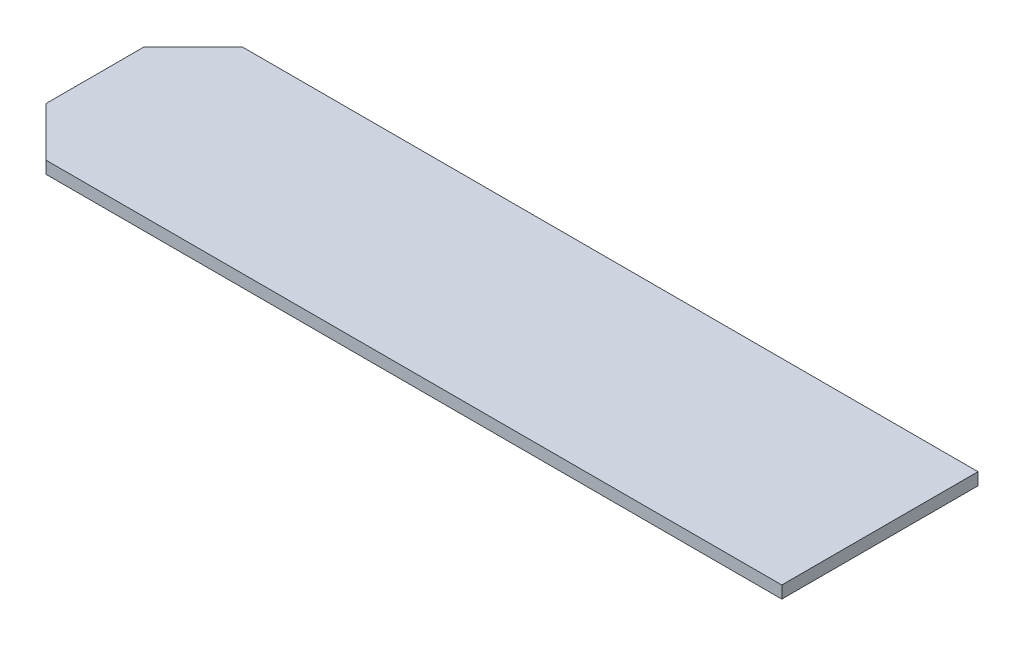
ISO-10303-21;
HEADER;
FILE_DESCRIPTION(('STEP AP214'),'2;1');
FILE_NAME('part.step','',(''),(''),'','','');
FILE_SCHEMA(('AUTOMOTIVE_DESIGN { 1 0 10303 214 1 1 1 1 }'));
ENDSEC;
DATA;
#1=APPLICATION_CONTEXT('core data for automotive mechanical design processes');
#2=APPLICATION_PROTOCOL_DEFINITION('international standard','automotive_design',2000,#1);
#3=PRODUCT_CONTEXT('',#1,'mechanical');
#4=PRODUCT('Part','Part','',(#3));
#5=PRODUCT_RELATED_PRODUCT_CATEGORY('part','',(#4));
#6=PRODUCT_DEFINITION_FORMATION('','',#4);
#7=PRODUCT_DEFINITION_CONTEXT('part definition',#1,'design');
#8=PRODUCT_DEFINITION('design','',#6,#7);
#9=PRODUCT_DEFINITION_SHAPE('','',#8);
#10=(LENGTH_UNIT() NAMED_UNIT(*) SI_UNIT(.MILLI.,.METRE.));
#11=(NAMED_UNIT(*) PLANE_ANGLE_UNIT() SI_UNIT($,.RADIAN.));
#12=(NAMED_UNIT(*) SI_UNIT($,.STERADIAN.) SOLID_ANGLE_UNIT());
#13=UNCERTAINTY_MEASURE_WITH_UNIT(LENGTH_MEASURE(1.E-05),#10,'distance_accuracy_value','');
#14=(GEOMETRIC_REPRESENTATION_CONTEXT(3) GLOBAL_UNCERTAINTY_ASSIGNED_CONTEXT((#13)) GLOBAL_UNIT_ASSIGNED_CONTEXT((#10,
#11,#12)) REPRESENTATION_CONTEXT('',''));
#15=CARTESIAN_POINT('',(0.,0.,0.));
#16=DIRECTION('',(0.,0.,1.));
#17=DIRECTION('',(1.,0.,0.));
#18=AXIS2_PLACEMENT_3D('',#15,#16,#17);
#19=CARTESIAN_POINT('',(0.,3.175,0.));
#20=DIRECTION('',(-1.,0.,0.));
#21=DIRECTION('',(0.,0.,1.));
#22=AXIS2_PLACEMENT_3D('',#19,#20,#21);
#23=PLANE('',#22);
#24=DIRECTION('',(0.,0.,-1.));
#25=VECTOR('',#24,1.);
#26=CARTESIAN_POINT('',(0.,0.,0.));
#27=LINE('',#26,#25);
#28=CARTESIAN_POINT('',(0.,0.,0.));
#29=VERTEX_POINT('',#28);
#30=CARTESIAN_POINT('',(0.,0.,-50.8));
#31=VERTEX_POINT('',#30);
#32=EDGE_CURVE('E105',#29,#31,#27,.T.);
#33=ORIENTED_EDGE('',*,*,#32,.T.);
#34=DIRECTION('',(0.,-1.,0.));
#35=VECTOR('',#34,1.);
#36=CARTESIAN_POINT('',(0.,3.175,-50.8));
#37=LINE('',#36,#35);
#38=CARTESIAN_POINT('',(0.,3.175,-50.8));
#39=VERTEX_POINT('',#38);
#40=EDGE_CURVE('E90',#39,#31,#37,.T.);
#41=ORIENTED_EDGE('',*,*,#40,.F.);
#42=DIRECTION('',(0.,0.,-1.));
#43=VECTOR('',#42,1.);
#44=CARTESIAN_POINT('',(0.,3.175,0.));
#45=LINE('',#44,#43);
#46=CARTESIAN_POINT('',(0.,3.175,0.));
#47=VERTEX_POINT('',#46);
#48=EDGE_CURVE('E94',#47,#39,#45,.T.);
#49=ORIENTED_EDGE('',*,*,#48,.F.);
#50=DIRECTION('',(0.,-1.,0.));
#51=VECTOR('',#50,1.);
#52=CARTESIAN_POINT('',(0.,3.175,0.));
#53=LINE('',#52,#51);
#54=EDGE_CURVE('E107',#47,#29,#53,.T.);
#55=ORIENTED_EDGE('',*,*,#54,.T.);
#56=EDGE_LOOP('',(#33,#41,#49,#55));
#57=FACE_BOUND('',#56,.T.);
#58=ADVANCED_FACE('F33',(#57),#23,.F.);
#59=CARTESIAN_POINT('',(0.,3.175,-50.8));
#60=DIRECTION('',(0.,0.,1.));
#61=DIRECTION('',(1.,0.,0.));
#62=AXIS2_PLACEMENT_3D('',#59,#60,#61);
#63=PLANE('',#62);
#64=DIRECTION('',(-1.,0.,0.));
#65=VECTOR('',#64,1.);
#66=CARTESIAN_POINT('',(0.,0.,-50.8));
#67=LINE('',#66,#65);
#68=CARTESIAN_POINT('',(-190.5,0.,-50.8));
#69=VERTEX_POINT('',#68);
#70=EDGE_CURVE('E133',#31,#69,#67,.T.);
#71=ORIENTED_EDGE('',*,*,#70,.T.);
#72=DIRECTION('',(0.,1.,0.));
#73=VECTOR('',#72,1.);
#74=CARTESIAN_POINT('',(-190.5,3.175,-50.8));
#75=LINE('',#74,#73);
#76=CARTESIAN_POINT('',(-190.5,3.175,-50.8));
#77=VERTEX_POINT('',#76);
#78=EDGE_CURVE('E56',#69,#77,#75,.T.);
#79=ORIENTED_EDGE('',*,*,#78,.T.);
#80=DIRECTION('',(-1.,0.,0.));
#81=VECTOR('',#80,1.);
#82=CARTESIAN_POINT('',(0.,3.175,-50.8));
#83=LINE('',#82,#81);
#84=EDGE_CURVE('E86',#39,#77,#83,.T.);
#85=ORIENTED_EDGE('',*,*,#84,.F.);
#86=ORIENTED_EDGE('',*,*,#40,.T.);
#87=EDGE_LOOP('',(#71,#79,#85,#86));
#88=FACE_BOUND('',#87,.T.);
#89=ADVANCED_FACE('F88',(#88),#63,.F.);
#90=CARTESIAN_POINT('',(-203.2,3.175,0.));
#91=DIRECTION('',(1.,0.,0.));
#92=DIRECTION('',(0.,0.,-1.));
#93=AXIS2_PLACEMENT_3D('',#90,#91,#92);
#94=PLANE('',#93);
#95=DIRECTION('',(0.,0.,1.));
#96=VECTOR('',#95,1.);
#97=CARTESIAN_POINT('',(-203.2,3.175,0.));
#98=LINE('',#97,#96);
#99=CARTESIAN_POINT('',(-203.2,3.175,-38.1));
#100=VERTEX_POINT('',#99);
#101=CARTESIAN_POINT('',(-203.2,3.175,-12.7));
#102=VERTEX_POINT('',#101);
#103=EDGE_CURVE('E93',#100,#102,#98,.T.);
#104=ORIENTED_EDGE('',*,*,#103,.F.);
#105=DIRECTION('',(0.,-1.,0.));
#106=VECTOR('',#105,1.);
#107=CARTESIAN_POINT('',(-203.2,3.175,-38.1));
#108=LINE('',#107,#106);
#109=CARTESIAN_POINT('',(-203.2,0.,-38.1));
#110=VERTEX_POINT('',#109);
#111=EDGE_CURVE('E109',#100,#110,#108,.T.);
#112=ORIENTED_EDGE('',*,*,#111,.T.);
#113=DIRECTION('',(0.,0.,1.));
#114=VECTOR('',#113,1.);
#115=CARTESIAN_POINT('',(-203.2,0.,0.));
#116=LINE('',#115,#114);
#117=CARTESIAN_POINT('',(-203.2,0.,-12.7));
#118=VERTEX_POINT('',#117);
#119=EDGE_CURVE('E134',#110,#118,#116,.T.);
#120=ORIENTED_EDGE('',*,*,#119,.T.);
#121=DIRECTION('',(0.,1.,0.));
#122=VECTOR('',#121,1.);
#123=CARTESIAN_POINT('',(-203.2,3.175,-12.7));
#124=LINE('',#123,#122);
#125=EDGE_CURVE('E106',#118,#102,#124,.T.);
#126=ORIENTED_EDGE('',*,*,#125,.T.);
#127=EDGE_LOOP('',(#104,#112,#120,#126));
#128=FACE_BOUND('',#127,.T.);
#129=ADVANCED_FACE('F125',(#128),#94,.F.);
#130=CARTESIAN_POINT('',(0.,3.175,0.));
#131=DIRECTION('',(0.,0.,-1.));
#132=DIRECTION('',(-1.,0.,0.));
#133=AXIS2_PLACEMENT_3D('',#130,#131,#132);
#134=PLANE('',#133);
#135=DIRECTION('',(1.,0.,0.));
#136=VECTOR('',#135,1.);
#137=CARTESIAN_POINT('',(0.,3.175,0.));
#138=LINE('',#137,#136);
#139=CARTESIAN_POINT('',(-190.5,3.175,0.));
#140=VERTEX_POINT('',#139);
#141=EDGE_CURVE('E98',#140,#47,#138,.T.);
#142=ORIENTED_EDGE('',*,*,#141,.F.);
#143=DIRECTION('',(0.,-1.,0.));
#144=VECTOR('',#143,1.);
#145=CARTESIAN_POINT('',(-190.5,3.175,0.));
#146=LINE('',#145,#144);
#147=CARTESIAN_POINT('',(-190.5,0.,0.));
#148=VERTEX_POINT('',#147);
#149=EDGE_CURVE('E11',#140,#148,#146,.T.);
#150=ORIENTED_EDGE('',*,*,#149,.T.);
#151=DIRECTION('',(1.,0.,0.));
#152=VECTOR('',#151,1.);
#153=CARTESIAN_POINT('',(0.,0.,0.));
#154=LINE('',#153,#152);
#155=EDGE_CURVE('E102',#148,#29,#154,.T.);
#156=ORIENTED_EDGE('',*,*,#155,.T.);
#157=ORIENTED_EDGE('',*,*,#54,.F.);
#158=EDGE_LOOP('',(#142,#150,#156,#157));
#159=FACE_BOUND('',#158,.T.);
#160=ADVANCED_FACE('F141',(#159),#134,.F.);
#161=CARTESIAN_POINT('',(0.,3.175,0.));
#162=DIRECTION('',(0.,1.,0.));
#163=DIRECTION('',(0.,0.,1.));
#164=AXIS2_PLACEMENT_3D('',#161,#162,#163);
#165=PLANE('',#164);
#166=ORIENTED_EDGE('',*,*,#84,.T.);
#167=DIRECTION('',(0.707106781186548,0.,-0.707106781186547));
#168=VECTOR('',#167,1.);
#169=CARTESIAN_POINT('',(-120.65,3.175,-120.65));
#170=LINE('',#169,#168);
#171=EDGE_CURVE('E41',#77,#100,#170,.F.);
#172=ORIENTED_EDGE('',*,*,#171,.T.);
#173=ORIENTED_EDGE('',*,*,#103,.T.);
#174=DIRECTION('',(-0.707106781186546,0.,-0.707106781186549));
#175=VECTOR('',#174,1.);
#176=CARTESIAN_POINT('',(-95.2500000000004,3.175,95.25));
#177=LINE('',#176,#175);
#178=EDGE_CURVE('E48',#102,#140,#177,.F.);
#179=ORIENTED_EDGE('',*,*,#178,.T.);
#180=ORIENTED_EDGE('',*,*,#141,.T.);
#181=ORIENTED_EDGE('',*,*,#48,.T.);
#182=EDGE_LOOP('',(#166,#172,#173,#179,#180,#181));
#183=FACE_BOUND('',#182,.T.);
#184=ADVANCED_FACE('F97',(#183),#165,.T.);
#185=CARTESIAN_POINT('',(0.,0.,0.));
#186=DIRECTION('',(0.,1.,0.));
#187=DIRECTION('',(0.,0.,1.));
#188=AXIS2_PLACEMENT_3D('',#185,#186,#187);
#189=PLANE('',#188);
#190=ORIENTED_EDGE('',*,*,#119,.F.);
#191=DIRECTION('',(-0.707106781186548,0.,0.707106781186547));
#192=VECTOR('',#191,1.);
#193=CARTESIAN_POINT('',(-203.2,0.,-38.1));
#194=LINE('',#193,#192);
#195=EDGE_CURVE('E118',#110,#69,#194,.F.);
#196=ORIENTED_EDGE('',*,*,#195,.T.);
#197=ORIENTED_EDGE('',*,*,#70,.F.);
#198=ORIENTED_EDGE('',*,*,#32,.F.);
#199=ORIENTED_EDGE('',*,*,#155,.F.);
#200=DIRECTION('',(0.707106781186546,0.,0.707106781186549));
#201=VECTOR('',#200,1.);
#202=CARTESIAN_POINT('',(-190.5,0.,0.));
#203=LINE('',#202,#201);
#204=EDGE_CURVE('E116',#148,#118,#203,.F.);
#205=ORIENTED_EDGE('',*,*,#204,.T.);
#206=EDGE_LOOP('',(#190,#196,#197,#198,#199,#205));
#207=FACE_BOUND('',#206,.T.);
#208=ADVANCED_FACE('F132',(#207),#189,.F.);
#209=CARTESIAN_POINT('',(-203.2,3.175,-38.1));
#210=DIRECTION('',(0.707106781186547,0.,0.707106781186548));
#211=DIRECTION('',(0.,-1.,0.));
#212=AXIS2_PLACEMENT_3D('',#209,#210,#211);
#213=PLANE('',#212);
#214=ORIENTED_EDGE('',*,*,#171,.F.);
#215=ORIENTED_EDGE('',*,*,#78,.F.);
#216=ORIENTED_EDGE('',*,*,#195,.F.);
#217=ORIENTED_EDGE('',*,*,#111,.F.);
#218=EDGE_LOOP('',(#214,#215,#216,#217));
#219=FACE_BOUND('',#218,.T.);
#220=ADVANCED_FACE('F130',(#219),#213,.F.);
#221=CARTESIAN_POINT('',(-190.5,3.175,0.));
#222=DIRECTION('',(0.707106781186549,0.,-0.707106781186546));
#223=DIRECTION('',(0.,-1.,0.));
#224=AXIS2_PLACEMENT_3D('',#221,#222,#223);
#225=PLANE('',#224);
#226=ORIENTED_EDGE('',*,*,#178,.F.);
#227=ORIENTED_EDGE('',*,*,#125,.F.);
#228=ORIENTED_EDGE('',*,*,#204,.F.);
#229=ORIENTED_EDGE('',*,*,#149,.F.);
#230=EDGE_LOOP('',(#226,#227,#228,#229));
#231=FACE_BOUND('',#230,.T.);
#232=ADVANCED_FACE('F35',(#231),#225,.F.);
#233=CLOSED_SHELL('',(#58,#89,#129,#160,#184,#208,#220,#232));
#234=MANIFOLD_SOLID_BREP('B2',#233);
#235=ADVANCED_BREP_SHAPE_REPRESENTATION('',(#18,#234),#14);
#236=SHAPE_DEFINITION_REPRESENTATION(#9,#235);
ENDSEC;
END-ISO-10303-21;
